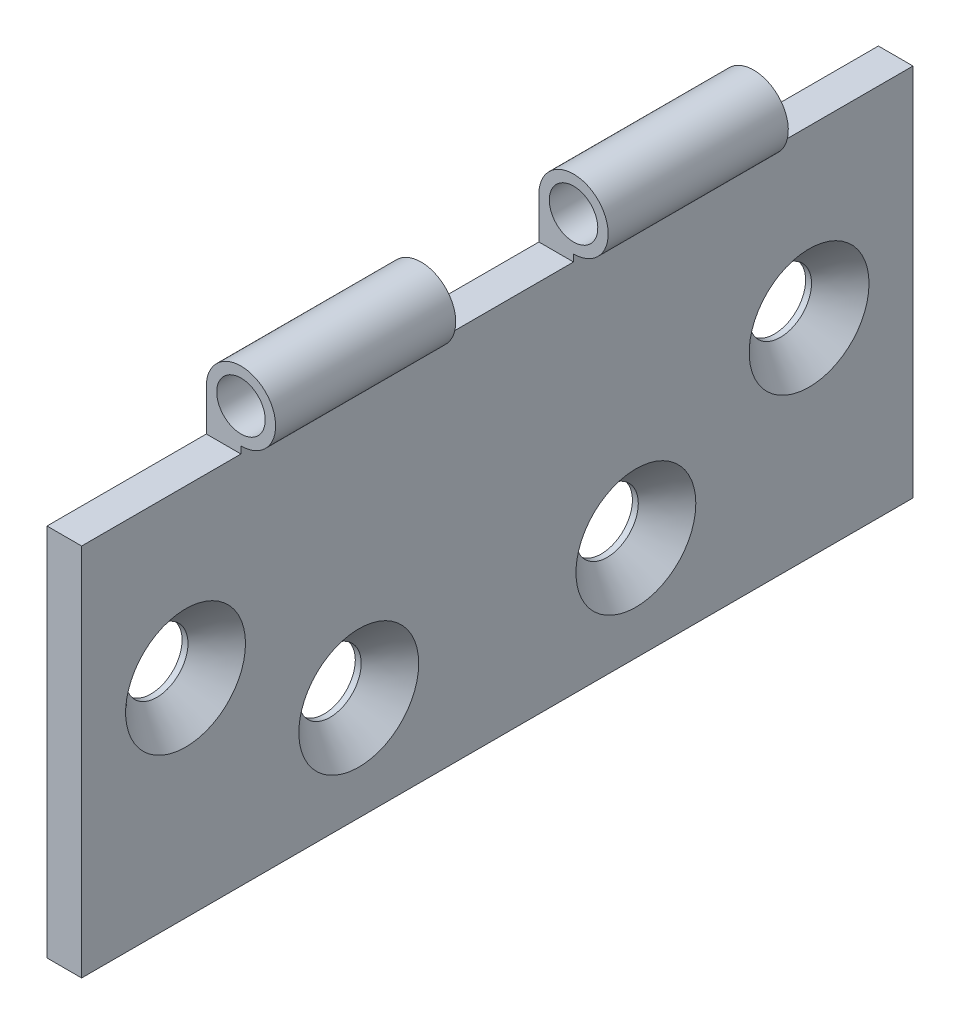
ISO-10303-21;
HEADER;
FILE_DESCRIPTION(('STEP AP214'),'2;1');
FILE_NAME('part.step','',(''),(''),'','','');
FILE_SCHEMA(('AUTOMOTIVE_DESIGN { 1 0 10303 214 1 1 1 1 }'));
ENDSEC;
DATA;
#1=APPLICATION_CONTEXT('core data for automotive mechanical design processes');
#2=APPLICATION_PROTOCOL_DEFINITION('international standard','automotive_design',2000,#1);
#3=PRODUCT_CONTEXT('',#1,'mechanical');
#4=PRODUCT('Part','Part','',(#3));
#5=PRODUCT_RELATED_PRODUCT_CATEGORY('part','',(#4));
#6=PRODUCT_DEFINITION_FORMATION('','',#4);
#7=PRODUCT_DEFINITION_CONTEXT('part definition',#1,'design');
#8=PRODUCT_DEFINITION('design','',#6,#7);
#9=PRODUCT_DEFINITION_SHAPE('','',#8);
#10=(LENGTH_UNIT() NAMED_UNIT(*) SI_UNIT(.MILLI.,.METRE.));
#11=(NAMED_UNIT(*) PLANE_ANGLE_UNIT() SI_UNIT($,.RADIAN.));
#12=(NAMED_UNIT(*) SI_UNIT($,.STERADIAN.) SOLID_ANGLE_UNIT());
#13=UNCERTAINTY_MEASURE_WITH_UNIT(LENGTH_MEASURE(1.E-05),#10,'distance_accuracy_value','');
#14=(GEOMETRIC_REPRESENTATION_CONTEXT(3) GLOBAL_UNCERTAINTY_ASSIGNED_CONTEXT((#13)) GLOBAL_UNIT_ASSIGNED_CONTEXT((#10,
#11,#12)) REPRESENTATION_CONTEXT('',''));
#15=CARTESIAN_POINT('',(0.,0.,0.));
#16=DIRECTION('',(0.,0.,1.));
#17=DIRECTION('',(1.,0.,0.));
#18=AXIS2_PLACEMENT_3D('',#15,#16,#17);
#19=CARTESIAN_POINT('',(5.,60.,-60.));
#20=DIRECTION('',(0.,0.,1.));
#21=DIRECTION('',(1.,0.,0.));
#22=AXIS2_PLACEMENT_3D('',#19,#20,#21);
#23=CYLINDRICAL_SURFACE('',#22,5.);
#24=CARTESIAN_POINT('',(5.,60.,-11.));
#25=DIRECTION('',(0.,0.,-1.));
#26=DIRECTION('',(-1.,0.,0.));
#27=AXIS2_PLACEMENT_3D('',#24,#25,#26);
#28=CIRCLE('',#27,5.);
#29=CARTESIAN_POINT('',(5.,55.,-11.));
#30=VERTEX_POINT('',#29);
#31=CARTESIAN_POINT('',(0.,60.,-11.));
#32=VERTEX_POINT('',#31);
#33=EDGE_CURVE('E161',#30,#32,#28,.F.);
#34=ORIENTED_EDGE('',*,*,#33,.F.);
#35=DIRECTION('',(0.,0.,1.));
#36=VECTOR('',#35,1.);
#37=CARTESIAN_POINT('',(5.,55.,-60.));
#38=LINE('',#37,#36);
#39=CARTESIAN_POINT('',(5.,55.,-37.));
#40=VERTEX_POINT('',#39);
#41=EDGE_CURVE('E243',#40,#30,#38,.T.);
#42=ORIENTED_EDGE('',*,*,#41,.F.);
#43=CARTESIAN_POINT('',(5.,60.,-37.));
#44=DIRECTION('',(0.,0.,1.));
#45=DIRECTION('',(0.,-1.,0.));
#46=AXIS2_PLACEMENT_3D('',#43,#44,#45);
#47=CIRCLE('',#46,5.);
#48=CARTESIAN_POINT('',(0.,60.,-37.));
#49=VERTEX_POINT('',#48);
#50=EDGE_CURVE('E69',#49,#40,#47,.F.);
#51=ORIENTED_EDGE('',*,*,#50,.F.);
#52=DIRECTION('',(0.,0.,-1.));
#53=VECTOR('',#52,1.);
#54=CARTESIAN_POINT('',(0.,60.,60.));
#55=LINE('',#54,#53);
#56=EDGE_CURVE('E44',#32,#49,#55,.T.);
#57=ORIENTED_EDGE('',*,*,#56,.F.);
#58=EDGE_LOOP('',(#34,#42,#51,#57));
#59=FACE_BOUND('',#58,.T.);
#60=ADVANCED_FACE('F34',(#59),#23,.T.);
#61=CARTESIAN_POINT('',(5.,55.,11.));
#62=VERTEX_POINT('',#61);
#63=CARTESIAN_POINT('',(5.,55.,37.));
#64=VERTEX_POINT('',#63);
#65=EDGE_CURVE('E242',#62,#64,#38,.T.);
#66=ORIENTED_EDGE('',*,*,#65,.F.);
#67=CARTESIAN_POINT('',(5.,60.,11.));
#68=DIRECTION('',(0.,0.,1.));
#69=DIRECTION('',(1.,0.,0.));
#70=AXIS2_PLACEMENT_3D('',#67,#68,#69);
#71=CIRCLE('',#70,5.);
#72=CARTESIAN_POINT('',(0.,60.,11.));
#73=VERTEX_POINT('',#72);
#74=EDGE_CURVE('E158',#73,#62,#71,.F.);
#75=ORIENTED_EDGE('',*,*,#74,.F.);
#76=CARTESIAN_POINT('',(0.,60.,37.));
#77=VERTEX_POINT('',#76);
#78=EDGE_CURVE('E11',#77,#73,#55,.T.);
#79=ORIENTED_EDGE('',*,*,#78,.F.);
#80=CARTESIAN_POINT('',(5.,60.,37.));
#81=DIRECTION('',(0.,0.,-1.));
#82=DIRECTION('',(0.,1.,0.));
#83=AXIS2_PLACEMENT_3D('',#80,#81,#82);
#84=CIRCLE('',#83,5.);
#85=EDGE_CURVE('E179',#64,#77,#84,.F.);
#86=ORIENTED_EDGE('',*,*,#85,.F.);
#87=EDGE_LOOP('',(#66,#75,#79,#86));
#88=FACE_BOUND('',#87,.T.);
#89=ADVANCED_FACE('F285',(#88),#23,.T.);
#90=CARTESIAN_POINT('',(5.,60.,-60.));
#91=DIRECTION('',(0.,0.,1.));
#92=DIRECTION('',(1.,0.,0.));
#93=AXIS2_PLACEMENT_3D('',#90,#91,#92);
#94=CYLINDRICAL_SURFACE('',#93,3.5);
#95=CARTESIAN_POINT('',(5.,60.,-11.));
#96=DIRECTION('',(0.,0.,-1.));
#97=DIRECTION('',(-1.,0.,0.));
#98=AXIS2_PLACEMENT_3D('',#95,#96,#97);
#99=CIRCLE('',#98,3.5);
#100=CARTESIAN_POINT('',(1.5,60.,-11.));
#101=VERTEX_POINT('',#100);
#102=EDGE_CURVE('E38',#101,#101,#99,.F.);
#103=ORIENTED_EDGE('',*,*,#102,.T.);
#104=EDGE_LOOP('',(#103));
#105=FACE_BOUND('',#104,.T.);
#106=CARTESIAN_POINT('',(5.,60.,-37.));
#107=DIRECTION('',(0.,0.,1.));
#108=DIRECTION('',(0.,-1.,0.));
#109=AXIS2_PLACEMENT_3D('',#106,#107,#108);
#110=CIRCLE('',#109,3.5);
#111=CARTESIAN_POINT('',(5.,56.5,-37.));
#112=VERTEX_POINT('',#111);
#113=EDGE_CURVE('E197',#112,#112,#110,.F.);
#114=ORIENTED_EDGE('',*,*,#113,.T.);
#115=EDGE_LOOP('',(#114));
#116=FACE_BOUND('',#115,.T.);
#117=ADVANCED_FACE('F291',(#105,#116),#94,.F.);
#118=CARTESIAN_POINT('',(5.,0.,60.));
#119=DIRECTION('',(-1.,0.,0.));
#120=DIRECTION('',(0.,0.,1.));
#121=AXIS2_PLACEMENT_3D('',#118,#119,#120);
#122=PLANE('',#121);
#123=CARTESIAN_POINT('',(5.,30.,-45.));
#124=DIRECTION('',(1.,0.,0.));
#125=DIRECTION('',(0.,0.,-1.));
#126=AXIS2_PLACEMENT_3D('',#123,#124,#125);
#127=CIRCLE('',#126,8.65);
#128=CARTESIAN_POINT('',(5.,30.,-53.65));
#129=VERTEX_POINT('',#128);
#130=EDGE_CURVE('E206',#129,#129,#127,.T.);
#131=ORIENTED_EDGE('',*,*,#130,.F.);
#132=EDGE_LOOP('',(#131));
#133=FACE_BOUND('',#132,.T.);
#134=CARTESIAN_POINT('',(5.,15.,-20.));
#135=DIRECTION('',(1.,0.,0.));
#136=DIRECTION('',(0.,0.,-1.));
#137=AXIS2_PLACEMENT_3D('',#134,#135,#136);
#138=CIRCLE('',#137,8.65);
#139=CARTESIAN_POINT('',(5.,15.,-28.65));
#140=VERTEX_POINT('',#139);
#141=EDGE_CURVE('E215',#140,#140,#138,.T.);
#142=ORIENTED_EDGE('',*,*,#141,.F.);
#143=EDGE_LOOP('',(#142));
#144=FACE_BOUND('',#143,.T.);
#145=CARTESIAN_POINT('',(5.,30.,45.));
#146=DIRECTION('',(1.,0.,0.));
#147=DIRECTION('',(0.,0.,-1.));
#148=AXIS2_PLACEMENT_3D('',#145,#146,#147);
#149=CIRCLE('',#148,8.65);
#150=CARTESIAN_POINT('',(5.,30.,36.35));
#151=VERTEX_POINT('',#150);
#152=EDGE_CURVE('E224',#151,#151,#149,.T.);
#153=ORIENTED_EDGE('',*,*,#152,.F.);
#154=EDGE_LOOP('',(#153));
#155=FACE_BOUND('',#154,.T.);
#156=CARTESIAN_POINT('',(5.,15.,20.));
#157=DIRECTION('',(1.,0.,0.));
#158=DIRECTION('',(0.,0.,-1.));
#159=AXIS2_PLACEMENT_3D('',#156,#157,#158);
#160=CIRCLE('',#159,8.65);
#161=CARTESIAN_POINT('',(5.,15.,11.35));
#162=VERTEX_POINT('',#161);
#163=EDGE_CURVE('E233',#162,#162,#160,.T.);
#164=ORIENTED_EDGE('',*,*,#163,.F.);
#165=EDGE_LOOP('',(#164));
#166=FACE_BOUND('',#165,.T.);
#167=ORIENTED_EDGE('',*,*,#41,.T.);
#168=DIRECTION('',(0.,-1.,0.));
#169=VECTOR('',#168,1.);
#170=CARTESIAN_POINT('',(5.,0.,-11.));
#171=LINE('',#170,#169);
#172=CARTESIAN_POINT('',(5.,54.,-11.));
#173=VERTEX_POINT('',#172);
#174=EDGE_CURVE('E163',#30,#173,#171,.T.);
#175=ORIENTED_EDGE('',*,*,#174,.T.);
#176=DIRECTION('',(0.,0.,1.));
#177=VECTOR('',#176,1.);
#178=CARTESIAN_POINT('',(5.,54.,60.));
#179=LINE('',#178,#177);
#180=CARTESIAN_POINT('',(5.,54.,11.));
#181=VERTEX_POINT('',#180);
#182=EDGE_CURVE('E166',#173,#181,#179,.T.);
#183=ORIENTED_EDGE('',*,*,#182,.T.);
#184=DIRECTION('',(0.,1.,0.));
#185=VECTOR('',#184,1.);
#186=CARTESIAN_POINT('',(5.,0.,11.));
#187=LINE('',#186,#185);
#188=EDGE_CURVE('E135',#181,#62,#187,.T.);
#189=ORIENTED_EDGE('',*,*,#188,.T.);
#190=ORIENTED_EDGE('',*,*,#65,.T.);
#191=DIRECTION('',(0.,-1.,0.));
#192=VECTOR('',#191,1.);
#193=CARTESIAN_POINT('',(5.,0.,37.));
#194=LINE('',#193,#192);
#195=CARTESIAN_POINT('',(5.,54.,37.));
#196=VERTEX_POINT('',#195);
#197=EDGE_CURVE('E181',#64,#196,#194,.T.);
#198=ORIENTED_EDGE('',*,*,#197,.T.);
#199=DIRECTION('',(0.,0.,1.));
#200=VECTOR('',#199,1.);
#201=CARTESIAN_POINT('',(5.,54.,60.));
#202=LINE('',#201,#200);
#203=CARTESIAN_POINT('',(5.,54.,60.));
#204=VERTEX_POINT('',#203);
#205=EDGE_CURVE('E184',#196,#204,#202,.T.);
#206=ORIENTED_EDGE('',*,*,#205,.T.);
#207=DIRECTION('',(0.,1.,0.));
#208=VECTOR('',#207,1.);
#209=CARTESIAN_POINT('',(5.,0.,60.));
#210=LINE('',#209,#208);
#211=CARTESIAN_POINT('',(5.,0.,60.));
#212=VERTEX_POINT('',#211);
#213=EDGE_CURVE('E247',#212,#204,#210,.T.);
#214=ORIENTED_EDGE('',*,*,#213,.F.);
#215=DIRECTION('',(0.,0.,-1.));
#216=VECTOR('',#215,1.);
#217=CARTESIAN_POINT('',(5.,0.,60.));
#218=LINE('',#217,#216);
#219=CARTESIAN_POINT('',(5.,0.,-60.));
#220=VERTEX_POINT('',#219);
#221=EDGE_CURVE('E53',#212,#220,#218,.T.);
#222=ORIENTED_EDGE('',*,*,#221,.T.);
#223=DIRECTION('',(0.,1.,0.));
#224=VECTOR('',#223,1.);
#225=CARTESIAN_POINT('',(5.,0.,-60.));
#226=LINE('',#225,#224);
#227=CARTESIAN_POINT('',(5.,54.,-60.));
#228=VERTEX_POINT('',#227);
#229=EDGE_CURVE('E246',#220,#228,#226,.T.);
#230=ORIENTED_EDGE('',*,*,#229,.T.);
#231=DIRECTION('',(0.,0.,1.));
#232=VECTOR('',#231,1.);
#233=CARTESIAN_POINT('',(5.,53.9999999999999,60.));
#234=LINE('',#233,#232);
#235=CARTESIAN_POINT('',(5.,54.,-37.));
#236=VERTEX_POINT('',#235);
#237=EDGE_CURVE('E203',#228,#236,#234,.T.);
#238=ORIENTED_EDGE('',*,*,#237,.T.);
#239=DIRECTION('',(0.,1.,0.));
#240=VECTOR('',#239,1.);
#241=CARTESIAN_POINT('',(5.,0.,-37.));
#242=LINE('',#241,#240);
#243=EDGE_CURVE('E201',#236,#40,#242,.T.);
#244=ORIENTED_EDGE('',*,*,#243,.T.);
#245=EDGE_LOOP('',(#167,#175,#183,#189,#190,#198,#206,#214,#222,#230,#238,#244));
#246=FACE_BOUND('',#245,.T.);
#247=ADVANCED_FACE('F36',(#133,#144,#155,#166,#246),#122,.F.);
#248=CARTESIAN_POINT('',(0.,0.,60.));
#249=DIRECTION('',(-1.,0.,0.));
#250=DIRECTION('',(0.,0.,1.));
#251=AXIS2_PLACEMENT_3D('',#248,#249,#250);
#252=PLANE('',#251);
#253=DIRECTION('',(0.,1.,0.));
#254=VECTOR('',#253,1.);
#255=CARTESIAN_POINT('',(0.,65.,-11.));
#256=LINE('',#255,#254);
#257=CARTESIAN_POINT('',(0.,54.,-11.));
#258=VERTEX_POINT('',#257);
#259=EDGE_CURVE('E139',#258,#32,#256,.T.);
#260=ORIENTED_EDGE('',*,*,#259,.T.);
#261=ORIENTED_EDGE('',*,*,#56,.T.);
#262=DIRECTION('',(0.,-1.,0.));
#263=VECTOR('',#262,1.);
#264=CARTESIAN_POINT('',(0.,65.,-37.));
#265=LINE('',#264,#263);
#266=CARTESIAN_POINT('',(0.,54.,-37.));
#267=VERTEX_POINT('',#266);
#268=EDGE_CURVE('E190',#49,#267,#265,.T.);
#269=ORIENTED_EDGE('',*,*,#268,.T.);
#270=DIRECTION('',(0.,0.,-1.));
#271=VECTOR('',#270,1.);
#272=CARTESIAN_POINT('',(0.,54.,-60.));
#273=LINE('',#272,#271);
#274=CARTESIAN_POINT('',(0.,54.,-60.));
#275=VERTEX_POINT('',#274);
#276=EDGE_CURVE('E187',#267,#275,#273,.T.);
#277=ORIENTED_EDGE('',*,*,#276,.T.);
#278=DIRECTION('',(0.,1.,0.));
#279=VECTOR('',#278,1.);
#280=CARTESIAN_POINT('',(0.,0.,-60.));
#281=LINE('',#280,#279);
#282=CARTESIAN_POINT('',(0.,0.,-60.));
#283=VERTEX_POINT('',#282);
#284=EDGE_CURVE('E258',#283,#275,#281,.T.);
#285=ORIENTED_EDGE('',*,*,#284,.F.);
#286=DIRECTION('',(0.,0.,-1.));
#287=VECTOR('',#286,1.);
#288=CARTESIAN_POINT('',(0.,0.,60.));
#289=LINE('',#288,#287);
#290=CARTESIAN_POINT('',(0.,0.,60.));
#291=VERTEX_POINT('',#290);
#292=EDGE_CURVE('E61',#291,#283,#289,.T.);
#293=ORIENTED_EDGE('',*,*,#292,.F.);
#294=DIRECTION('',(0.,1.,0.));
#295=VECTOR('',#294,1.);
#296=CARTESIAN_POINT('',(0.,0.,60.));
#297=LINE('',#296,#295);
#298=CARTESIAN_POINT('',(0.,54.,60.));
#299=VERTEX_POINT('',#298);
#300=EDGE_CURVE('E250',#291,#299,#297,.T.);
#301=ORIENTED_EDGE('',*,*,#300,.T.);
#302=DIRECTION('',(0.,0.,-1.));
#303=VECTOR('',#302,1.);
#304=CARTESIAN_POINT('',(0.,54.,37.));
#305=LINE('',#304,#303);
#306=CARTESIAN_POINT('',(0.,54.,37.));
#307=VERTEX_POINT('',#306);
#308=EDGE_CURVE('E168',#299,#307,#305,.T.);
#309=ORIENTED_EDGE('',*,*,#308,.T.);
#310=DIRECTION('',(0.,1.,0.));
#311=VECTOR('',#310,1.);
#312=CARTESIAN_POINT('',(0.,65.,37.));
#313=LINE('',#312,#311);
#314=EDGE_CURVE('E171',#307,#77,#313,.T.);
#315=ORIENTED_EDGE('',*,*,#314,.T.);
#316=ORIENTED_EDGE('',*,*,#78,.T.);
#317=DIRECTION('',(0.,-1.,0.));
#318=VECTOR('',#317,1.);
#319=CARTESIAN_POINT('',(0.,65.,11.));
#320=LINE('',#319,#318);
#321=CARTESIAN_POINT('',(0.,54.,11.));
#322=VERTEX_POINT('',#321);
#323=EDGE_CURVE('E132',#73,#322,#320,.T.);
#324=ORIENTED_EDGE('',*,*,#323,.T.);
#325=DIRECTION('',(0.,0.,-1.));
#326=VECTOR('',#325,1.);
#327=CARTESIAN_POINT('',(0.,54.,-11.));
#328=LINE('',#327,#326);
#329=EDGE_CURVE('E142',#322,#258,#328,.T.);
#330=ORIENTED_EDGE('',*,*,#329,.T.);
#331=EDGE_LOOP('',(#260,#261,#269,#277,#285,#293,#301,#309,#315,#316,#324,#330));
#332=FACE_BOUND('',#331,.T.);
#333=CARTESIAN_POINT('',(0.,30.,-45.));
#334=DIRECTION('',(1.,0.,0.));
#335=DIRECTION('',(0.,0.,-1.));
#336=AXIS2_PLACEMENT_3D('',#333,#334,#335);
#337=CIRCLE('',#336,4.5);
#338=CARTESIAN_POINT('',(0.,30.,-49.5));
#339=VERTEX_POINT('',#338);
#340=EDGE_CURVE('E212',#339,#339,#337,.T.);
#341=ORIENTED_EDGE('',*,*,#340,.T.);
#342=EDGE_LOOP('',(#341));
#343=FACE_BOUND('',#342,.T.);
#344=CARTESIAN_POINT('',(0.,15.,-20.));
#345=DIRECTION('',(1.,0.,0.));
#346=DIRECTION('',(0.,0.,-1.));
#347=AXIS2_PLACEMENT_3D('',#344,#345,#346);
#348=CIRCLE('',#347,4.5);
#349=CARTESIAN_POINT('',(0.,15.,-24.5));
#350=VERTEX_POINT('',#349);
#351=EDGE_CURVE('E221',#350,#350,#348,.T.);
#352=ORIENTED_EDGE('',*,*,#351,.T.);
#353=EDGE_LOOP('',(#352));
#354=FACE_BOUND('',#353,.T.);
#355=CARTESIAN_POINT('',(0.,30.,45.));
#356=DIRECTION('',(1.,0.,0.));
#357=DIRECTION('',(0.,0.,-1.));
#358=AXIS2_PLACEMENT_3D('',#355,#356,#357);
#359=CIRCLE('',#358,4.5);
#360=CARTESIAN_POINT('',(0.,30.,40.5));
#361=VERTEX_POINT('',#360);
#362=EDGE_CURVE('E230',#361,#361,#359,.T.);
#363=ORIENTED_EDGE('',*,*,#362,.T.);
#364=EDGE_LOOP('',(#363));
#365=FACE_BOUND('',#364,.T.);
#366=CARTESIAN_POINT('',(0.,15.,20.));
#367=DIRECTION('',(1.,0.,0.));
#368=DIRECTION('',(0.,0.,-1.));
#369=AXIS2_PLACEMENT_3D('',#366,#367,#368);
#370=CIRCLE('',#369,4.5);
#371=CARTESIAN_POINT('',(0.,15.,15.5));
#372=VERTEX_POINT('',#371);
#373=EDGE_CURVE('E239',#372,#372,#370,.T.);
#374=ORIENTED_EDGE('',*,*,#373,.T.);
#375=EDGE_LOOP('',(#374));
#376=FACE_BOUND('',#375,.T.);
#377=ADVANCED_FACE('F149',(#332,#343,#354,#365,#376),#252,.T.);
#378=CARTESIAN_POINT('',(5.,0.,60.));
#379=DIRECTION('',(0.,-1.,0.));
#380=DIRECTION('',(0.,0.,-1.));
#381=AXIS2_PLACEMENT_3D('',#378,#379,#380);
#382=PLANE('',#381);
#383=DIRECTION('',(-1.,0.,0.));
#384=VECTOR('',#383,1.);
#385=CARTESIAN_POINT('',(5.,0.,-60.));
#386=LINE('',#385,#384);
#387=EDGE_CURVE('E251',#220,#283,#386,.T.);
#388=ORIENTED_EDGE('',*,*,#387,.F.);
#389=ORIENTED_EDGE('',*,*,#221,.F.);
#390=DIRECTION('',(-1.,0.,0.));
#391=VECTOR('',#390,1.);
#392=CARTESIAN_POINT('',(5.,0.,60.));
#393=LINE('',#392,#391);
#394=EDGE_CURVE('E254',#212,#291,#393,.T.);
#395=ORIENTED_EDGE('',*,*,#394,.T.);
#396=ORIENTED_EDGE('',*,*,#292,.T.);
#397=EDGE_LOOP('',(#388,#389,#395,#396));
#398=FACE_BOUND('',#397,.T.);
#399=ADVANCED_FACE('F300',(#398),#382,.T.);
#400=CARTESIAN_POINT('',(0.,0.,60.));
#401=DIRECTION('',(0.,0.,-1.));
#402=DIRECTION('',(-1.,0.,0.));
#403=AXIS2_PLACEMENT_3D('',#400,#401,#402);
#404=PLANE('',#403);
#405=ORIENTED_EDGE('',*,*,#213,.T.);
#406=DIRECTION('',(1.,0.,0.));
#407=VECTOR('',#406,1.);
#408=CARTESIAN_POINT('',(0.,54.,60.));
#409=LINE('',#408,#407);
#410=EDGE_CURVE('E173',#299,#204,#409,.T.);
#411=ORIENTED_EDGE('',*,*,#410,.F.);
#412=ORIENTED_EDGE('',*,*,#300,.F.);
#413=ORIENTED_EDGE('',*,*,#394,.F.);
#414=EDGE_LOOP('',(#405,#411,#412,#413));
#415=FACE_BOUND('',#414,.T.);
#416=ADVANCED_FACE('F296',(#415),#404,.F.);
#417=CARTESIAN_POINT('',(0.,0.,-60.));
#418=DIRECTION('',(0.,0.,-1.));
#419=DIRECTION('',(-1.,0.,0.));
#420=AXIS2_PLACEMENT_3D('',#417,#418,#419);
#421=PLANE('',#420);
#422=DIRECTION('',(1.,0.,0.));
#423=VECTOR('',#422,1.);
#424=CARTESIAN_POINT('',(0.,54.,-60.));
#425=LINE('',#424,#423);
#426=EDGE_CURVE('E193',#275,#228,#425,.T.);
#427=ORIENTED_EDGE('',*,*,#426,.T.);
#428=ORIENTED_EDGE('',*,*,#229,.F.);
#429=ORIENTED_EDGE('',*,*,#387,.T.);
#430=ORIENTED_EDGE('',*,*,#284,.T.);
#431=EDGE_LOOP('',(#427,#428,#429,#430));
#432=FACE_BOUND('',#431,.T.);
#433=ADVANCED_FACE('F299',(#432),#421,.T.);
#434=CARTESIAN_POINT('',(5.,60.,11.));
#435=DIRECTION('',(0.,0.,1.));
#436=DIRECTION('',(1.,0.,0.));
#437=AXIS2_PLACEMENT_3D('',#434,#435,#436);
#438=CIRCLE('',#437,3.5);
#439=CARTESIAN_POINT('',(8.5,60.,11.));
#440=VERTEX_POINT('',#439);
#441=EDGE_CURVE('E156',#440,#440,#438,.F.);
#442=ORIENTED_EDGE('',*,*,#441,.T.);
#443=EDGE_LOOP('',(#442));
#444=FACE_BOUND('',#443,.T.);
#445=CARTESIAN_POINT('',(5.,60.,37.));
#446=DIRECTION('',(0.,0.,-1.));
#447=DIRECTION('',(0.,1.,0.));
#448=AXIS2_PLACEMENT_3D('',#445,#446,#447);
#449=CIRCLE('',#448,3.5);
#450=CARTESIAN_POINT('',(5.,63.5,37.));
#451=VERTEX_POINT('',#450);
#452=EDGE_CURVE('E177',#451,#451,#449,.F.);
#453=ORIENTED_EDGE('',*,*,#452,.T.);
#454=EDGE_LOOP('',(#453));
#455=FACE_BOUND('',#454,.T.);
#456=ADVANCED_FACE('F271',(#444,#455),#94,.F.);
#457=CARTESIAN_POINT('',(5.,15.,20.));
#458=DIRECTION('',(1.,0.,0.));
#459=DIRECTION('',(0.,0.,-1.));
#460=AXIS2_PLACEMENT_3D('',#457,#458,#459);
#461=CYLINDRICAL_SURFACE('',#460,4.5);
#462=ORIENTED_EDGE('',*,*,#373,.F.);
#463=EDGE_LOOP('',(#462));
#464=FACE_BOUND('',#463,.T.);
#465=CARTESIAN_POINT('',(0.850000000000003,15.,20.));
#466=DIRECTION('',(1.,0.,0.));
#467=DIRECTION('',(0.,0.,-1.));
#468=AXIS2_PLACEMENT_3D('',#465,#466,#467);
#469=CIRCLE('',#468,4.5);
#470=CARTESIAN_POINT('',(0.850000000000003,15.,15.5));
#471=VERTEX_POINT('',#470);
#472=EDGE_CURVE('E236',#471,#471,#469,.T.);
#473=ORIENTED_EDGE('',*,*,#472,.T.);
#474=EDGE_LOOP('',(#473));
#475=FACE_BOUND('',#474,.T.);
#476=ADVANCED_FACE('F383',(#464,#475),#461,.F.);
#477=CARTESIAN_POINT('',(5.,15.,20.));
#478=DIRECTION('',(1.,0.,0.));
#479=DIRECTION('',(0.,0.,-1.));
#480=AXIS2_PLACEMENT_3D('',#477,#478,#479);
#481=CONICAL_SURFACE('',#480,8.65,0.785398163397448);
#482=ORIENTED_EDGE('',*,*,#472,.F.);
#483=EDGE_LOOP('',(#482));
#484=FACE_BOUND('',#483,.T.);
#485=ORIENTED_EDGE('',*,*,#163,.T.);
#486=EDGE_LOOP('',(#485));
#487=FACE_BOUND('',#486,.T.);
#488=ADVANCED_FACE('F380',(#484,#487),#481,.F.);
#489=CARTESIAN_POINT('',(5.,30.,45.));
#490=DIRECTION('',(1.,0.,0.));
#491=DIRECTION('',(0.,0.,-1.));
#492=AXIS2_PLACEMENT_3D('',#489,#490,#491);
#493=CYLINDRICAL_SURFACE('',#492,4.5);
#494=ORIENTED_EDGE('',*,*,#362,.F.);
#495=EDGE_LOOP('',(#494));
#496=FACE_BOUND('',#495,.T.);
#497=CARTESIAN_POINT('',(0.850000000000003,30.,45.));
#498=DIRECTION('',(1.,0.,0.));
#499=DIRECTION('',(0.,0.,-1.));
#500=AXIS2_PLACEMENT_3D('',#497,#498,#499);
#501=CIRCLE('',#500,4.5);
#502=CARTESIAN_POINT('',(0.850000000000003,30.,40.5));
#503=VERTEX_POINT('',#502);
#504=EDGE_CURVE('E227',#503,#503,#501,.T.);
#505=ORIENTED_EDGE('',*,*,#504,.T.);
#506=EDGE_LOOP('',(#505));
#507=FACE_BOUND('',#506,.T.);
#508=ADVANCED_FACE('F376',(#496,#507),#493,.F.);
#509=CARTESIAN_POINT('',(5.,30.,45.));
#510=DIRECTION('',(1.,0.,0.));
#511=DIRECTION('',(0.,0.,-1.));
#512=AXIS2_PLACEMENT_3D('',#509,#510,#511);
#513=CONICAL_SURFACE('',#512,8.65,0.785398163397449);
#514=ORIENTED_EDGE('',*,*,#504,.F.);
#515=EDGE_LOOP('',(#514));
#516=FACE_BOUND('',#515,.T.);
#517=ORIENTED_EDGE('',*,*,#152,.T.);
#518=EDGE_LOOP('',(#517));
#519=FACE_BOUND('',#518,.T.);
#520=ADVANCED_FACE('F372',(#516,#519),#513,.F.);
#521=CARTESIAN_POINT('',(5.,15.,-20.));
#522=DIRECTION('',(1.,0.,0.));
#523=DIRECTION('',(0.,0.,-1.));
#524=AXIS2_PLACEMENT_3D('',#521,#522,#523);
#525=CYLINDRICAL_SURFACE('',#524,4.5);
#526=ORIENTED_EDGE('',*,*,#351,.F.);
#527=EDGE_LOOP('',(#526));
#528=FACE_BOUND('',#527,.T.);
#529=CARTESIAN_POINT('',(0.850000000000003,15.,-20.));
#530=DIRECTION('',(1.,0.,0.));
#531=DIRECTION('',(0.,0.,-1.));
#532=AXIS2_PLACEMENT_3D('',#529,#530,#531);
#533=CIRCLE('',#532,4.5);
#534=CARTESIAN_POINT('',(0.850000000000003,15.,-24.5));
#535=VERTEX_POINT('',#534);
#536=EDGE_CURVE('E218',#535,#535,#533,.T.);
#537=ORIENTED_EDGE('',*,*,#536,.T.);
#538=EDGE_LOOP('',(#537));
#539=FACE_BOUND('',#538,.T.);
#540=ADVANCED_FACE('F368',(#528,#539),#525,.F.);
#541=CARTESIAN_POINT('',(5.,15.,-20.));
#542=DIRECTION('',(1.,0.,0.));
#543=DIRECTION('',(0.,0.,-1.));
#544=AXIS2_PLACEMENT_3D('',#541,#542,#543);
#545=CONICAL_SURFACE('',#544,8.65,0.785398163397448);
#546=ORIENTED_EDGE('',*,*,#536,.F.);
#547=EDGE_LOOP('',(#546));
#548=FACE_BOUND('',#547,.T.);
#549=ORIENTED_EDGE('',*,*,#141,.T.);
#550=EDGE_LOOP('',(#549));
#551=FACE_BOUND('',#550,.T.);
#552=ADVANCED_FACE('F364',(#548,#551),#545,.F.);
#553=CARTESIAN_POINT('',(5.,30.,-45.));
#554=DIRECTION('',(1.,0.,0.));
#555=DIRECTION('',(0.,0.,-1.));
#556=AXIS2_PLACEMENT_3D('',#553,#554,#555);
#557=CYLINDRICAL_SURFACE('',#556,4.5);
#558=ORIENTED_EDGE('',*,*,#340,.F.);
#559=EDGE_LOOP('',(#558));
#560=FACE_BOUND('',#559,.T.);
#561=CARTESIAN_POINT('',(0.850000000000003,30.,-45.));
#562=DIRECTION('',(1.,0.,0.));
#563=DIRECTION('',(0.,0.,-1.));
#564=AXIS2_PLACEMENT_3D('',#561,#562,#563);
#565=CIRCLE('',#564,4.5);
#566=CARTESIAN_POINT('',(0.850000000000003,30.,-49.5));
#567=VERTEX_POINT('',#566);
#568=EDGE_CURVE('E209',#567,#567,#565,.T.);
#569=ORIENTED_EDGE('',*,*,#568,.T.);
#570=EDGE_LOOP('',(#569));
#571=FACE_BOUND('',#570,.T.);
#572=ADVANCED_FACE('F360',(#560,#571),#557,.F.);
#573=CARTESIAN_POINT('',(5.,30.,-45.));
#574=DIRECTION('',(1.,0.,0.));
#575=DIRECTION('',(0.,0.,-1.));
#576=AXIS2_PLACEMENT_3D('',#573,#574,#575);
#577=CONICAL_SURFACE('',#576,8.65,0.785398163397449);
#578=ORIENTED_EDGE('',*,*,#568,.F.);
#579=EDGE_LOOP('',(#578));
#580=FACE_BOUND('',#579,.T.);
#581=ORIENTED_EDGE('',*,*,#130,.T.);
#582=EDGE_LOOP('',(#581));
#583=FACE_BOUND('',#582,.T.);
#584=ADVANCED_FACE('F357',(#580,#583),#577,.F.);
#585=CARTESIAN_POINT('',(0.,54.,-60.));
#586=DIRECTION('',(0.,-1.,0.));
#587=DIRECTION('',(0.,0.,-1.));
#588=AXIS2_PLACEMENT_3D('',#585,#586,#587);
#589=PLANE('',#588);
#590=ORIENTED_EDGE('',*,*,#426,.F.);
#591=ORIENTED_EDGE('',*,*,#276,.F.);
#592=DIRECTION('',(1.,0.,0.));
#593=VECTOR('',#592,1.);
#594=CARTESIAN_POINT('',(0.,54.,-37.));
#595=LINE('',#594,#593);
#596=EDGE_CURVE('E194',#267,#236,#595,.T.);
#597=ORIENTED_EDGE('',*,*,#596,.T.);
#598=ORIENTED_EDGE('',*,*,#237,.F.);
#599=EDGE_LOOP('',(#590,#591,#597,#598));
#600=FACE_BOUND('',#599,.T.);
#601=ADVANCED_FACE('F330',(#600),#589,.F.);
#602=CARTESIAN_POINT('',(0.,65.,-37.));
#603=DIRECTION('',(0.,0.,1.));
#604=DIRECTION('',(0.,-1.,0.));
#605=AXIS2_PLACEMENT_3D('',#602,#603,#604);
#606=PLANE('',#605);
#607=ORIENTED_EDGE('',*,*,#113,.F.);
#608=EDGE_LOOP('',(#607));
#609=FACE_BOUND('',#608,.T.);
#610=ORIENTED_EDGE('',*,*,#596,.F.);
#611=ORIENTED_EDGE('',*,*,#268,.F.);
#612=ORIENTED_EDGE('',*,*,#50,.T.);
#613=ORIENTED_EDGE('',*,*,#243,.F.);
#614=EDGE_LOOP('',(#610,#611,#612,#613));
#615=FACE_BOUND('',#614,.T.);
#616=ADVANCED_FACE('F327',(#609,#615),#606,.F.);
#617=CARTESIAN_POINT('',(0.,54.,37.));
#618=DIRECTION('',(0.,-1.,0.));
#619=DIRECTION('',(0.,0.,-1.));
#620=AXIS2_PLACEMENT_3D('',#617,#618,#619);
#621=PLANE('',#620);
#622=DIRECTION('',(1.,0.,0.));
#623=VECTOR('',#622,1.);
#624=CARTESIAN_POINT('',(0.,54.,37.));
#625=LINE('',#624,#623);
#626=EDGE_CURVE('E174',#307,#196,#625,.T.);
#627=ORIENTED_EDGE('',*,*,#626,.F.);
#628=ORIENTED_EDGE('',*,*,#308,.F.);
#629=ORIENTED_EDGE('',*,*,#410,.T.);
#630=ORIENTED_EDGE('',*,*,#205,.F.);
#631=EDGE_LOOP('',(#627,#628,#629,#630));
#632=FACE_BOUND('',#631,.T.);
#633=ADVANCED_FACE('F337',(#632),#621,.F.);
#634=CARTESIAN_POINT('',(0.,65.,37.));
#635=DIRECTION('',(0.,0.,-1.));
#636=DIRECTION('',(0.,1.,0.));
#637=AXIS2_PLACEMENT_3D('',#634,#635,#636);
#638=PLANE('',#637);
#639=ORIENTED_EDGE('',*,*,#452,.F.);
#640=EDGE_LOOP('',(#639));
#641=FACE_BOUND('',#640,.T.);
#642=ORIENTED_EDGE('',*,*,#197,.F.);
#643=ORIENTED_EDGE('',*,*,#85,.T.);
#644=ORIENTED_EDGE('',*,*,#314,.F.);
#645=ORIENTED_EDGE('',*,*,#626,.T.);
#646=EDGE_LOOP('',(#642,#643,#644,#645));
#647=FACE_BOUND('',#646,.T.);
#648=ADVANCED_FACE('F340',(#641,#647),#638,.F.);
#649=CARTESIAN_POINT('',(0.,54.,-11.));
#650=DIRECTION('',(0.,-1.,0.));
#651=DIRECTION('',(0.,0.,-1.));
#652=AXIS2_PLACEMENT_3D('',#649,#650,#651);
#653=PLANE('',#652);
#654=DIRECTION('',(1.,0.,0.));
#655=VECTOR('',#654,1.);
#656=CARTESIAN_POINT('',(0.,54.,-11.));
#657=LINE('',#656,#655);
#658=EDGE_CURVE('E138',#258,#173,#657,.T.);
#659=ORIENTED_EDGE('',*,*,#658,.F.);
#660=ORIENTED_EDGE('',*,*,#329,.F.);
#661=DIRECTION('',(1.,0.,0.));
#662=VECTOR('',#661,1.);
#663=CARTESIAN_POINT('',(0.,54.,11.));
#664=LINE('',#663,#662);
#665=EDGE_CURVE('E128',#322,#181,#664,.T.);
#666=ORIENTED_EDGE('',*,*,#665,.T.);
#667=ORIENTED_EDGE('',*,*,#182,.F.);
#668=EDGE_LOOP('',(#659,#660,#666,#667));
#669=FACE_BOUND('',#668,.T.);
#670=ADVANCED_FACE('F143',(#669),#653,.F.);
#671=CARTESIAN_POINT('',(0.,65.,-11.));
#672=DIRECTION('',(0.,0.,-1.));
#673=DIRECTION('',(-1.,0.,0.));
#674=AXIS2_PLACEMENT_3D('',#671,#672,#673);
#675=PLANE('',#674);
#676=ORIENTED_EDGE('',*,*,#102,.F.);
#677=EDGE_LOOP('',(#676));
#678=FACE_BOUND('',#677,.T.);
#679=ORIENTED_EDGE('',*,*,#174,.F.);
#680=ORIENTED_EDGE('',*,*,#33,.T.);
#681=ORIENTED_EDGE('',*,*,#259,.F.);
#682=ORIENTED_EDGE('',*,*,#658,.T.);
#683=EDGE_LOOP('',(#679,#680,#681,#682));
#684=FACE_BOUND('',#683,.T.);
#685=ADVANCED_FACE('F275',(#678,#684),#675,.F.);
#686=CARTESIAN_POINT('',(0.,65.,11.));
#687=DIRECTION('',(0.,0.,1.));
#688=DIRECTION('',(1.,0.,0.));
#689=AXIS2_PLACEMENT_3D('',#686,#687,#688);
#690=PLANE('',#689);
#691=ORIENTED_EDGE('',*,*,#441,.F.);
#692=EDGE_LOOP('',(#691));
#693=FACE_BOUND('',#692,.T.);
#694=ORIENTED_EDGE('',*,*,#665,.F.);
#695=ORIENTED_EDGE('',*,*,#323,.F.);
#696=ORIENTED_EDGE('',*,*,#74,.T.);
#697=ORIENTED_EDGE('',*,*,#188,.F.);
#698=EDGE_LOOP('',(#694,#695,#696,#697));
#699=FACE_BOUND('',#698,.T.);
#700=ADVANCED_FACE('F130',(#693,#699),#690,.F.);
#701=CLOSED_SHELL('',(#60,#89,#117,#247,#377,#399,#416,#433,#456,#476,#488,#508,#520,#540,#552,
#572,#584,#601,#616,#633,#648,#670,#685,#700));
#702=MANIFOLD_SOLID_BREP('B2',#701);
#703=ADVANCED_BREP_SHAPE_REPRESENTATION('',(#18,#702),#14);
#704=SHAPE_DEFINITION_REPRESENTATION(#9,#703);
ENDSEC;
END-ISO-10303-21;
